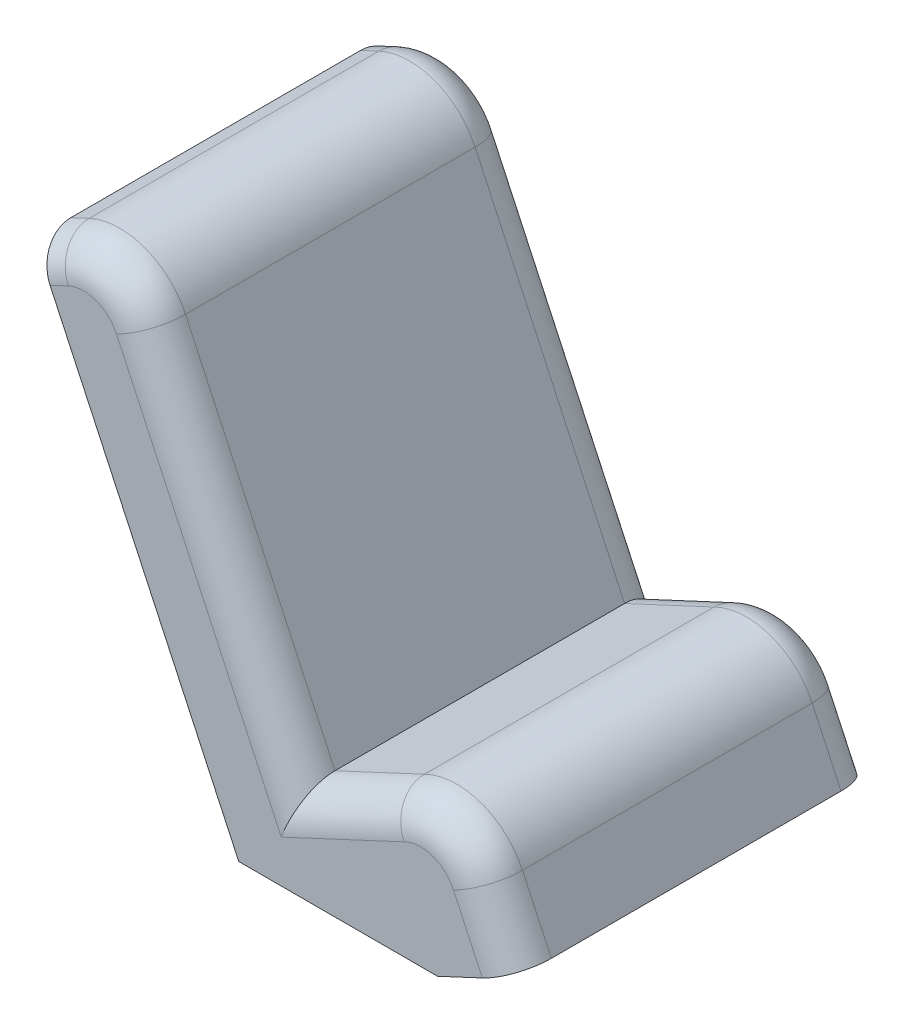
ISO-10303-21;
HEADER;
FILE_DESCRIPTION(('STEP AP214'),'2;1');
FILE_NAME('part.step','',(''),(''),'','','');
FILE_SCHEMA(('AUTOMOTIVE_DESIGN { 1 0 10303 214 1 1 1 1 }'));
ENDSEC;
DATA;
#1=APPLICATION_CONTEXT('core data for automotive mechanical design processes');
#2=APPLICATION_PROTOCOL_DEFINITION('international standard','automotive_design',2000,#1);
#3=PRODUCT_CONTEXT('',#1,'mechanical');
#4=PRODUCT('Part','Part','',(#3));
#5=PRODUCT_RELATED_PRODUCT_CATEGORY('part','',(#4));
#6=PRODUCT_DEFINITION_FORMATION('','',#4);
#7=PRODUCT_DEFINITION_CONTEXT('part definition',#1,'design');
#8=PRODUCT_DEFINITION('design','',#6,#7);
#9=PRODUCT_DEFINITION_SHAPE('','',#8);
#10=(LENGTH_UNIT() NAMED_UNIT(*) SI_UNIT(.MILLI.,.METRE.));
#11=(NAMED_UNIT(*) PLANE_ANGLE_UNIT() SI_UNIT($,.RADIAN.));
#12=(NAMED_UNIT(*) SI_UNIT($,.STERADIAN.) SOLID_ANGLE_UNIT());
#13=UNCERTAINTY_MEASURE_WITH_UNIT(LENGTH_MEASURE(1.E-05),#10,'distance_accuracy_value','');
#14=(GEOMETRIC_REPRESENTATION_CONTEXT(3) GLOBAL_UNCERTAINTY_ASSIGNED_CONTEXT((#13)) GLOBAL_UNIT_ASSIGNED_CONTEXT((#10,
#11,#12)) REPRESENTATION_CONTEXT('',''));
#15=CARTESIAN_POINT('',(0.,0.,0.));
#16=DIRECTION('',(0.,0.,1.));
#17=DIRECTION('',(1.,0.,0.));
#18=AXIS2_PLACEMENT_3D('',#15,#16,#17);
#19=CARTESIAN_POINT('',(-55.9569189786001,120.,50.));
#20=DIRECTION('',(0.422618261740701,-0.906307787036649,0.));
#21=DIRECTION('',(0.906307787036649,0.422618261740701,0.));
#22=AXIS2_PLACEMENT_3D('',#19,#20,#21);
#23=PLANE('',#22);
#24=DIRECTION('',(-0.906307787036649,-0.422618261740701,0.));
#25=VECTOR('',#24,1.);
#26=CARTESIAN_POINT('',(-55.9569189786001,120.,-40.));
#27=LINE('',#26,#25);
#28=CARTESIAN_POINT('',(-49.0830747193332,123.205326219061,-40.));
#29=VERTEX_POINT('',#28);
#30=CARTESIAN_POINT('',(-54.1443034045268,120.845236523481,-40.));
#31=VERTEX_POINT('',#30);
#32=EDGE_CURVE('E367',#29,#31,#27,.T.);
#33=ORIENTED_EDGE('',*,*,#32,.T.);
#34=DIRECTION('',(0.,0.,1.));
#35=VECTOR('',#34,1.);
#36=CARTESIAN_POINT('',(-54.1443034045268,120.845236523481,50.));
#37=LINE('',#36,#35);
#38=CARTESIAN_POINT('',(-54.1443034045268,120.845236523481,40.));
#39=VERTEX_POINT('',#38);
#40=EDGE_CURVE('E62',#31,#39,#37,.T.);
#41=ORIENTED_EDGE('',*,*,#40,.T.);
#42=DIRECTION('',(-0.906307787036649,-0.422618261740701,0.));
#43=VECTOR('',#42,1.);
#44=CARTESIAN_POINT('',(-49.0830747193332,123.205326219061,40.));
#45=LINE('',#44,#43);
#46=CARTESIAN_POINT('',(-49.0830747193332,123.205326219061,40.));
#47=VERTEX_POINT('',#46);
#48=EDGE_CURVE('E243',#39,#47,#45,.F.);
#49=ORIENTED_EDGE('',*,*,#48,.T.);
#50=DIRECTION('',(0.,0.,-1.));
#51=VECTOR('',#50,1.);
#52=CARTESIAN_POINT('',(-49.0830747193332,123.205326219061,50.));
#53=LINE('',#52,#51);
#54=EDGE_CURVE('E199',#47,#29,#53,.T.);
#55=ORIENTED_EDGE('',*,*,#54,.T.);
#56=EDGE_LOOP('',(#33,#41,#49,#55));
#57=FACE_BOUND('',#56,.T.);
#58=ADVANCED_FACE('F37',(#57),#23,.F.);
#59=CARTESIAN_POINT('',(-55.9569189786001,120.,50.));
#60=DIRECTION('',(0.906307787036649,0.422618261740701,0.));
#61=DIRECTION('',(-0.422618261740701,0.906307787036649,0.));
#62=AXIS2_PLACEMENT_3D('',#59,#60,#61);
#63=PLANE('',#62);
#64=CARTESIAN_POINT('',(-51.7307363611931,110.936922129634,-40.));
#65=DIRECTION('',(0.906307787036649,0.422618261740701,0.));
#66=DIRECTION('',(-0.422618261740701,0.906307787036649,0.));
#67=AXIS2_PLACEMENT_3D('',#64,#65,#66);
#68=CIRCLE('',#67,8.);
#69=CARTESIAN_POINT('',(-55.1116824551187,118.187384425927,-40.));
#70=VERTEX_POINT('',#69);
#71=CARTESIAN_POINT('',(-51.7307363611931,110.936922129634,-48.));
#72=VERTEX_POINT('',#71);
#73=EDGE_CURVE('E325',#70,#72,#68,.F.);
#74=ORIENTED_EDGE('',*,*,#73,.T.);
#75=DIRECTION('',(0.422618261740701,-0.906307787036649,0.));
#76=VECTOR('',#75,1.);
#77=CARTESIAN_POINT('',(-55.9569189786001,120.,-48.));
#78=LINE('',#77,#76);
#79=CARTESIAN_POINT('',(0.,0.,-48.));
#80=VERTEX_POINT('',#79);
#81=EDGE_CURVE('E327',#72,#80,#78,.T.);
#82=ORIENTED_EDGE('',*,*,#81,.T.);
#83=DIRECTION('',(0.,0.,-1.));
#84=VECTOR('',#83,1.);
#85=CARTESIAN_POINT('',(0.,0.,50.));
#86=LINE('',#85,#84);
#87=CARTESIAN_POINT('',(0.,0.,48.));
#88=VERTEX_POINT('',#87);
#89=EDGE_CURVE('E192',#88,#80,#86,.T.);
#90=ORIENTED_EDGE('',*,*,#89,.F.);
#91=DIRECTION('',(-0.422618261740701,0.906307787036649,0.));
#92=VECTOR('',#91,1.);
#93=CARTESIAN_POINT('',(-51.7307363611931,110.936922129633,48.));
#94=LINE('',#93,#92);
#95=CARTESIAN_POINT('',(-51.7307363611931,110.936922129634,48.));
#96=VERTEX_POINT('',#95);
#97=EDGE_CURVE('E318',#88,#96,#94,.T.);
#98=ORIENTED_EDGE('',*,*,#97,.T.);
#99=CARTESIAN_POINT('',(-51.7307363611931,110.936922129634,40.));
#100=DIRECTION('',(0.906307787036649,0.422618261740701,0.));
#101=DIRECTION('',(-0.422618261740701,0.906307787036649,0.));
#102=AXIS2_PLACEMENT_3D('',#99,#100,#101);
#103=CIRCLE('',#102,8.);
#104=CARTESIAN_POINT('',(-55.1116824551187,118.187384425927,40.));
#105=VERTEX_POINT('',#104);
#106=EDGE_CURVE('E320',#96,#105,#103,.F.);
#107=ORIENTED_EDGE('',*,*,#106,.T.);
#108=DIRECTION('',(0.,0.,-1.));
#109=VECTOR('',#108,1.);
#110=CARTESIAN_POINT('',(-55.1116824551187,118.187384425927,50.));
#111=LINE('',#110,#109);
#112=EDGE_CURVE('E323',#105,#70,#111,.T.);
#113=ORIENTED_EDGE('',*,*,#112,.T.);
#114=EDGE_LOOP('',(#74,#82,#90,#98,#107,#113));
#115=FACE_BOUND('',#114,.T.);
#116=ADVANCED_FACE('F438',(#115),#63,.F.);
#117=CARTESIAN_POINT('',(0.,0.,50.));
#118=DIRECTION('',(0.,1.,0.));
#119=DIRECTION('',(0.,0.,1.));
#120=AXIS2_PLACEMENT_3D('',#117,#118,#119);
#121=PLANE('',#120);
#122=CARTESIAN_POINT('',(30.,0.,0.));
#123=DIRECTION('',(0.,1.,0.));
#124=DIRECTION('',(0.,0.,1.));
#125=AXIS2_PLACEMENT_3D('',#122,#123,#124);
#126=CIRCLE('',#125,7.5);
#127=CARTESIAN_POINT('',(30.,0.,7.5));
#128=VERTEX_POINT('',#127);
#129=EDGE_CURVE('E223',#128,#128,#126,.F.);
#130=ORIENTED_EDGE('',*,*,#129,.F.);
#131=EDGE_LOOP('',(#130));
#132=FACE_BOUND('',#131,.T.);
#133=ORIENTED_EDGE('',*,*,#89,.T.);
#134=DIRECTION('',(-0.740965645273291,0.,0.671542934237816));
#135=VECTOR('',#134,1.);
#136=CARTESIAN_POINT('',(-30.7220321216671,0.,-20.1563830545432));
#137=LINE('',#136,#135);
#138=CARTESIAN_POINT('',(2.20675583792499,0.,-50.));
#139=VERTEX_POINT('',#138);
#140=EDGE_CURVE('E332',#80,#139,#137,.F.);
#141=ORIENTED_EDGE('',*,*,#140,.T.);
#142=DIRECTION('',(1.,0.,0.));
#143=VECTOR('',#142,1.);
#144=CARTESIAN_POINT('',(0.,0.,-50.));
#145=LINE('',#144,#143);
#146=CARTESIAN_POINT('',(57.1,0.,-50.));
#147=VERTEX_POINT('',#146);
#148=EDGE_CURVE('E188',#139,#147,#145,.T.);
#149=ORIENTED_EDGE('',*,*,#148,.T.);
#150=DIRECTION('',(0.,0.,-1.));
#151=VECTOR('',#150,1.);
#152=CARTESIAN_POINT('',(57.1,0.,50.));
#153=LINE('',#152,#151);
#154=CARTESIAN_POINT('',(57.1,0.,50.));
#155=VERTEX_POINT('',#154);
#156=EDGE_CURVE('E184',#155,#147,#153,.T.);
#157=ORIENTED_EDGE('',*,*,#156,.F.);
#158=DIRECTION('',(1.,0.,0.));
#159=VECTOR('',#158,1.);
#160=CARTESIAN_POINT('',(0.,0.,50.));
#161=LINE('',#160,#159);
#162=CARTESIAN_POINT('',(2.20675583792499,0.,50.));
#163=VERTEX_POINT('',#162);
#164=EDGE_CURVE('E171',#163,#155,#161,.T.);
#165=ORIENTED_EDGE('',*,*,#164,.F.);
#166=DIRECTION('',(-0.740965645273291,0.,-0.671542934237816));
#167=VECTOR('',#166,1.);
#168=CARTESIAN_POINT('',(-24.0910683230393,0.,26.1660771807977));
#169=LINE('',#168,#167);
#170=EDGE_CURVE('E330',#163,#88,#169,.T.);
#171=ORIENTED_EDGE('',*,*,#170,.T.);
#172=EDGE_LOOP('',(#133,#141,#149,#157,#165,#171));
#173=FACE_BOUND('',#172,.T.);
#174=ADVANCED_FACE('F186',(#132,#173),#121,.F.);
#175=CARTESIAN_POINT('',(57.1,0.,50.));
#176=DIRECTION('',(-0.422618261740701,0.906307787036649,0.));
#177=DIRECTION('',(-0.906307787036649,-0.422618261740701,0.));
#178=AXIS2_PLACEMENT_3D('',#175,#176,#177);
#179=PLANE('',#178);
#180=DIRECTION('',(0.906307787036649,0.422618261740701,0.));
#181=VECTOR('',#180,1.);
#182=CARTESIAN_POINT('',(57.1,0.,-50.));
#183=LINE('',#182,#181);
#184=CARTESIAN_POINT('',(69.481991334729,5.77381738259299,-50.));
#185=VERTEX_POINT('',#184);
#186=EDGE_CURVE('E181',#147,#185,#183,.T.);
#187=ORIENTED_EDGE('',*,*,#186,.T.);
#188=CARTESIAN_POINT('',(69.481991334729,5.77381738259299,-40.));
#189=DIRECTION('',(-0.422618261740701,0.906307787036649,0.));
#190=DIRECTION('',(-0.906307787036649,-0.422618261740701,0.));
#191=AXIS2_PLACEMENT_3D('',#188,#189,#190);
#192=CIRCLE('',#191,10.);
#193=CARTESIAN_POINT('',(78.5450692050955,10.,-40.));
#194=VERTEX_POINT('',#193);
#195=EDGE_CURVE('E381',#185,#194,#192,.F.);
#196=ORIENTED_EDGE('',*,*,#195,.T.);
#197=DIRECTION('',(0.,0.,-1.));
#198=VECTOR('',#197,1.);
#199=CARTESIAN_POINT('',(78.5450692050955,10.,50.));
#200=LINE('',#199,#198);
#201=CARTESIAN_POINT('',(78.5450692050955,10.,40.));
#202=VERTEX_POINT('',#201);
#203=EDGE_CURVE('E193',#202,#194,#200,.T.);
#204=ORIENTED_EDGE('',*,*,#203,.F.);
#205=CARTESIAN_POINT('',(69.481991334729,5.77381738259297,40.));
#206=DIRECTION('',(-0.422618261740701,0.906307787036649,0.));
#207=DIRECTION('',(-0.906307787036649,-0.422618261740701,0.));
#208=AXIS2_PLACEMENT_3D('',#205,#206,#207);
#209=CIRCLE('',#208,10.);
#210=CARTESIAN_POINT('',(69.481991334729,5.77381738259299,50.));
#211=VERTEX_POINT('',#210);
#212=EDGE_CURVE('E198',#202,#211,#209,.F.);
#213=ORIENTED_EDGE('',*,*,#212,.T.);
#214=DIRECTION('',(0.906307787036649,0.422618261740701,0.));
#215=VECTOR('',#214,1.);
#216=CARTESIAN_POINT('',(57.1,0.,50.));
#217=LINE('',#216,#215);
#218=EDGE_CURVE('E176',#155,#211,#217,.T.);
#219=ORIENTED_EDGE('',*,*,#218,.F.);
#220=ORIENTED_EDGE('',*,*,#156,.T.);
#221=EDGE_LOOP('',(#187,#196,#204,#213,#219,#220));
#222=FACE_BOUND('',#221,.T.);
#223=ADVANCED_FACE('F195',(#222),#179,.F.);
#224=CARTESIAN_POINT('',(78.5450692050955,10.,50.));
#225=DIRECTION('',(-0.906307787036649,-0.422618261740702,0.));
#226=DIRECTION('',(0.422618261740702,-0.906307787036649,0.));
#227=AXIS2_PLACEMENT_3D('',#224,#225,#226);
#228=PLANE('',#227);
#229=ORIENTED_EDGE('',*,*,#203,.T.);
#230=DIRECTION('',(-0.422618261740702,0.906307787036649,0.));
#231=VECTOR('',#230,1.);
#232=CARTESIAN_POINT('',(78.5450692050955,10.,-40.));
#233=LINE('',#232,#231);
#234=CARTESIAN_POINT('',(70.5740684534012,27.0938662753953,-40.));
#235=VERTEX_POINT('',#234);
#236=EDGE_CURVE('E251',#194,#235,#233,.T.);
#237=ORIENTED_EDGE('',*,*,#236,.T.);
#238=DIRECTION('',(0.,0.,-1.));
#239=VECTOR('',#238,1.);
#240=CARTESIAN_POINT('',(70.5740684534012,27.0938662753953,50.));
#241=LINE('',#240,#239);
#242=CARTESIAN_POINT('',(70.5740684534012,27.0938662753953,40.));
#243=VERTEX_POINT('',#242);
#244=EDGE_CURVE('E217',#243,#235,#241,.T.);
#245=ORIENTED_EDGE('',*,*,#244,.F.);
#246=DIRECTION('',(-0.422618261740702,0.906307787036649,0.));
#247=VECTOR('',#246,1.);
#248=CARTESIAN_POINT('',(78.5450692050955,9.99999999999999,40.));
#249=LINE('',#248,#247);
#250=EDGE_CURVE('E238',#243,#202,#249,.F.);
#251=ORIENTED_EDGE('',*,*,#250,.T.);
#252=EDGE_LOOP('',(#229,#237,#245,#251));
#253=FACE_BOUND('',#252,.T.);
#254=ADVANCED_FACE('F371',(#253),#228,.F.);
#255=CARTESIAN_POINT('',(52.4479127126682,18.6415010405812,50.));
#256=DIRECTION('',(0.,0.,-1.));
#257=DIRECTION('',(-1.,0.,0.));
#258=AXIS2_PLACEMENT_3D('',#255,#256,#257);
#259=CYLINDRICAL_SURFACE('',#258,20.);
#260=ORIENTED_EDGE('',*,*,#244,.T.);
#261=CARTESIAN_POINT('',(52.4479127126682,18.6415010405812,-40.));
#262=DIRECTION('',(0.,0.,1.));
#263=DIRECTION('',(1.,0.,0.));
#264=AXIS2_PLACEMENT_3D('',#261,#262,#263);
#265=CIRCLE('',#264,20.);
#266=CARTESIAN_POINT('',(43.49,36.5232179556937,-40.));
#267=VERTEX_POINT('',#266);
#268=EDGE_CURVE('E362',#235,#267,#265,.T.);
#269=ORIENTED_EDGE('',*,*,#268,.T.);
#270=DIRECTION('',(0.,0.,-1.));
#271=VECTOR('',#270,1.);
#272=CARTESIAN_POINT('',(43.49,36.5232179556937,50.));
#273=LINE('',#272,#271);
#274=CARTESIAN_POINT('',(43.49,36.5232179556937,40.));
#275=VERTEX_POINT('',#274);
#276=EDGE_CURVE('E214',#275,#267,#273,.T.);
#277=ORIENTED_EDGE('',*,*,#276,.F.);
#278=CARTESIAN_POINT('',(52.4479127126682,18.6415010405812,40.));
#279=DIRECTION('',(0.,0.,1.));
#280=DIRECTION('',(1.,0.,0.));
#281=AXIS2_PLACEMENT_3D('',#278,#279,#280);
#282=CIRCLE('',#281,20.);
#283=EDGE_CURVE('E245',#275,#243,#282,.F.);
#284=ORIENTED_EDGE('',*,*,#283,.T.);
#285=EDGE_LOOP('',(#260,#269,#277,#284));
#286=FACE_BOUND('',#285,.T.);
#287=ADVANCED_FACE('F375',(#286),#259,.T.);
#288=CARTESIAN_POINT('',(43.49,36.5232179556937,50.));
#289=DIRECTION('',(0.4226182617407,-0.906307787036649,0.));
#290=DIRECTION('',(0.90630778703665,0.4226182617407,0.));
#291=AXIS2_PLACEMENT_3D('',#288,#289,#290);
#292=PLANE('',#291);
#293=ORIENTED_EDGE('',*,*,#276,.T.);
#294=DIRECTION('',(-0.90630778703665,-0.4226182617407,0.));
#295=VECTOR('',#294,1.);
#296=CARTESIAN_POINT('',(43.49,36.5232179556937,-40.));
#297=LINE('',#296,#295);
#298=CARTESIAN_POINT('',(18.778379347475,25.,-40.));
#299=VERTEX_POINT('',#298);
#300=EDGE_CURVE('E366',#267,#299,#297,.T.);
#301=ORIENTED_EDGE('',*,*,#300,.T.);
#302=DIRECTION('',(0.,0.,-1.));
#303=VECTOR('',#302,1.);
#304=CARTESIAN_POINT('',(18.778379347475,25.,50.));
#305=LINE('',#304,#303);
#306=CARTESIAN_POINT('',(18.778379347475,25.,40.));
#307=VERTEX_POINT('',#306);
#308=EDGE_CURVE('E211',#307,#299,#305,.T.);
#309=ORIENTED_EDGE('',*,*,#308,.F.);
#310=DIRECTION('',(-0.90630778703665,-0.4226182617407,0.));
#311=VECTOR('',#310,1.);
#312=CARTESIAN_POINT('',(43.49,36.5232179556937,40.));
#313=LINE('',#312,#311);
#314=EDGE_CURVE('E247',#307,#275,#313,.F.);
#315=ORIENTED_EDGE('',*,*,#314,.T.);
#316=EDGE_LOOP('',(#293,#301,#309,#315));
#317=FACE_BOUND('',#316,.T.);
#318=ADVANCED_FACE('F423',(#317),#292,.F.);
#319=CARTESIAN_POINT('',(18.778379347475,25.,50.));
#320=DIRECTION('',(-0.906307787036649,-0.422618261740701,0.));
#321=DIRECTION('',(0.422618261740701,-0.906307787036649,0.));
#322=AXIS2_PLACEMENT_3D('',#319,#320,#321);
#323=PLANE('',#322);
#324=ORIENTED_EDGE('',*,*,#308,.T.);
#325=DIRECTION('',(-0.422618261740701,0.906307787036649,0.));
#326=VECTOR('',#325,1.);
#327=CARTESIAN_POINT('',(18.778379347475,25.,-40.));
#328=LINE('',#327,#326);
#329=CARTESIAN_POINT('',(-22.504553743786,113.531535713142,-40.));
#330=VERTEX_POINT('',#329);
#331=EDGE_CURVE('E382',#299,#330,#328,.T.);
#332=ORIENTED_EDGE('',*,*,#331,.T.);
#333=DIRECTION('',(0.,0.,-1.));
#334=VECTOR('',#333,1.);
#335=CARTESIAN_POINT('',(-22.504553743786,113.531535713142,50.));
#336=LINE('',#335,#334);
#337=CARTESIAN_POINT('',(-22.504553743786,113.531535713142,40.));
#338=VERTEX_POINT('',#337);
#339=EDGE_CURVE('E202',#338,#330,#336,.T.);
#340=ORIENTED_EDGE('',*,*,#339,.F.);
#341=DIRECTION('',(-0.422618261740701,0.906307787036649,0.));
#342=VECTOR('',#341,1.);
#343=CARTESIAN_POINT('',(18.778379347475,25.,40.));
#344=LINE('',#343,#342);
#345=EDGE_CURVE('E241',#338,#307,#344,.F.);
#346=ORIENTED_EDGE('',*,*,#345,.T.);
#347=EDGE_LOOP('',(#324,#332,#340,#346));
#348=FACE_BOUND('',#347,.T.);
#349=ADVANCED_FACE('F427',(#348),#323,.F.);
#350=CARTESIAN_POINT('',(-40.6307094845191,105.079170478328,50.));
#351=DIRECTION('',(0.,0.,-1.));
#352=DIRECTION('',(-1.,0.,0.));
#353=AXIS2_PLACEMENT_3D('',#350,#351,#352);
#354=CYLINDRICAL_SURFACE('',#353,20.);
#355=ORIENTED_EDGE('',*,*,#339,.T.);
#356=CARTESIAN_POINT('',(-40.6307094845191,105.079170478328,-40.));
#357=DIRECTION('',(0.,0.,1.));
#358=DIRECTION('',(1.,0.,0.));
#359=AXIS2_PLACEMENT_3D('',#356,#357,#358);
#360=CIRCLE('',#359,20.);
#361=EDGE_CURVE('E321',#330,#29,#360,.T.);
#362=ORIENTED_EDGE('',*,*,#361,.T.);
#363=ORIENTED_EDGE('',*,*,#54,.F.);
#364=CARTESIAN_POINT('',(-40.6307094845191,105.079170478328,40.));
#365=DIRECTION('',(0.,0.,1.));
#366=DIRECTION('',(1.,0.,0.));
#367=AXIS2_PLACEMENT_3D('',#364,#365,#366);
#368=CIRCLE('',#367,20.);
#369=EDGE_CURVE('E249',#47,#338,#368,.F.);
#370=ORIENTED_EDGE('',*,*,#369,.T.);
#371=EDGE_LOOP('',(#355,#362,#363,#370));
#372=FACE_BOUND('',#371,.T.);
#373=ADVANCED_FACE('F393',(#372),#354,.T.);
#374=CARTESIAN_POINT('',(-40.6307094845191,105.079170478328,50.));
#375=DIRECTION('',(0.,0.,1.));
#376=DIRECTION('',(1.,0.,0.));
#377=AXIS2_PLACEMENT_3D('',#374,#375,#376);
#378=PLANE('',#377);
#379=DIRECTION('',(-0.906307787036649,-0.422618261740701,0.));
#380=VECTOR('',#379,1.);
#381=CARTESIAN_POINT('',(-51.7307363611931,110.936922129634,50.));
#382=LINE('',#381,#380);
#383=CARTESIAN_POINT('',(-44.8568921019262,114.142248348694,50.));
#384=VERTEX_POINT('',#383);
#385=CARTESIAN_POINT('',(-49.9181207871198,111.782158653115,50.));
#386=VERTEX_POINT('',#385);
#387=EDGE_CURVE('E228',#384,#386,#382,.T.);
#388=ORIENTED_EDGE('',*,*,#387,.T.);
#389=DIRECTION('',(0.422618261740701,-0.906307787036649,0.));
#390=VECTOR('',#389,1.);
#391=CARTESIAN_POINT('',(1.8126155740733,0.845236523481404,50.));
#392=LINE('',#391,#390);
#393=EDGE_CURVE('E11',#386,#163,#392,.T.);
#394=ORIENTED_EDGE('',*,*,#393,.T.);
#395=ORIENTED_EDGE('',*,*,#164,.T.);
#396=ORIENTED_EDGE('',*,*,#218,.T.);
#397=DIRECTION('',(-0.422618261740702,0.906307787036649,0.));
#398=VECTOR('',#397,1.);
#399=CARTESIAN_POINT('',(61.5109905830347,22.8676836579882,50.));
#400=LINE('',#399,#398);
#401=CARTESIAN_POINT('',(61.5109905830347,22.8676836579882,50.));
#402=VERTEX_POINT('',#401);
#403=EDGE_CURVE('E236',#211,#402,#400,.T.);
#404=ORIENTED_EDGE('',*,*,#403,.T.);
#405=CARTESIAN_POINT('',(52.4479127126682,18.6415010405812,50.));
#406=DIRECTION('',(0.,0.,1.));
#407=DIRECTION('',(1.,0.,0.));
#408=AXIS2_PLACEMENT_3D('',#405,#406,#407);
#409=CIRCLE('',#408,10.);
#410=CARTESIAN_POINT('',(47.8652653123671,27.5296584876854,50.));
#411=VERTEX_POINT('',#410);
#412=EDGE_CURVE('E234',#402,#411,#409,.T.);
#413=ORIENTED_EDGE('',*,*,#412,.T.);
#414=DIRECTION('',(-0.90630778703665,-0.4226182617407,0.));
#415=VECTOR('',#414,1.);
#416=CARTESIAN_POINT('',(23.004561964882,15.9369221296335,50.));
#417=LINE('',#416,#415);
#418=CARTESIAN_POINT('',(13.9414840945155,11.7107395122265,50.));
#419=VERTEX_POINT('',#418);
#420=EDGE_CURVE('E232',#411,#419,#417,.T.);
#421=ORIENTED_EDGE('',*,*,#420,.T.);
#422=DIRECTION('',(-0.422618261740701,0.906307787036649,0.));
#423=VECTOR('',#422,1.);
#424=CARTESIAN_POINT('',(-31.5676316141525,109.305353095735,50.));
#425=LINE('',#424,#423);
#426=CARTESIAN_POINT('',(-31.5676316141525,109.305353095735,50.));
#427=VERTEX_POINT('',#426);
#428=EDGE_CURVE('E230',#419,#427,#425,.T.);
#429=ORIENTED_EDGE('',*,*,#428,.T.);
#430=CARTESIAN_POINT('',(-40.6307094845191,105.079170478328,50.));
#431=DIRECTION('',(0.,0.,1.));
#432=DIRECTION('',(1.,0.,0.));
#433=AXIS2_PLACEMENT_3D('',#430,#431,#432);
#434=CIRCLE('',#433,10.);
#435=EDGE_CURVE('E226',#427,#384,#434,.T.);
#436=ORIENTED_EDGE('',*,*,#435,.T.);
#437=EDGE_LOOP('',(#388,#394,#395,#396,#404,#413,#421,#429,#436));
#438=FACE_BOUND('',#437,.T.);
#439=ADVANCED_FACE('F173',(#438),#378,.T.);
#440=CARTESIAN_POINT('',(-40.6307094845191,105.079170478328,-50.));
#441=DIRECTION('',(0.,0.,1.));
#442=DIRECTION('',(1.,0.,0.));
#443=AXIS2_PLACEMENT_3D('',#440,#441,#442);
#444=PLANE('',#443);
#445=ORIENTED_EDGE('',*,*,#148,.F.);
#446=DIRECTION('',(-0.422618261740701,0.906307787036649,0.));
#447=VECTOR('',#446,1.);
#448=CARTESIAN_POINT('',(-45.6919381697128,102.719080782748,-50.));
#449=LINE('',#448,#447);
#450=CARTESIAN_POINT('',(-49.9181207871198,111.782158653115,-50.));
#451=VERTEX_POINT('',#450);
#452=EDGE_CURVE('E334',#139,#451,#449,.T.);
#453=ORIENTED_EDGE('',*,*,#452,.T.);
#454=DIRECTION('',(-0.906307787036649,-0.422618261740701,0.));
#455=VECTOR('',#454,1.);
#456=CARTESIAN_POINT('',(-44.8568921019261,114.142248348695,-50.));
#457=LINE('',#456,#455);
#458=CARTESIAN_POINT('',(-44.8568921019262,114.142248348694,-50.));
#459=VERTEX_POINT('',#458);
#460=EDGE_CURVE('E408',#451,#459,#457,.F.);
#461=ORIENTED_EDGE('',*,*,#460,.T.);
#462=CARTESIAN_POINT('',(-40.6307094845191,105.079170478328,-50.));
#463=DIRECTION('',(0.,0.,1.));
#464=DIRECTION('',(1.,0.,0.));
#465=AXIS2_PLACEMENT_3D('',#462,#463,#464);
#466=CIRCLE('',#465,10.);
#467=CARTESIAN_POINT('',(-31.5676316141525,109.305353095735,-50.));
#468=VERTEX_POINT('',#467);
#469=EDGE_CURVE('E373',#459,#468,#466,.F.);
#470=ORIENTED_EDGE('',*,*,#469,.T.);
#471=DIRECTION('',(-0.422618261740701,0.906307787036649,0.));
#472=VECTOR('',#471,1.);
#473=CARTESIAN_POINT('',(-31.5676316141526,109.305353095735,-50.));
#474=LINE('',#473,#472);
#475=CARTESIAN_POINT('',(13.9414840945155,11.7107395122265,-50.));
#476=VERTEX_POINT('',#475);
#477=EDGE_CURVE('E410',#468,#476,#474,.F.);
#478=ORIENTED_EDGE('',*,*,#477,.T.);
#479=DIRECTION('',(-0.90630778703665,-0.4226182617407,0.));
#480=VECTOR('',#479,1.);
#481=CARTESIAN_POINT('',(4.87840622414897,7.48455689481947,-50.));
#482=LINE('',#481,#480);
#483=CARTESIAN_POINT('',(47.8652653123672,27.5296584876855,-50.));
#484=VERTEX_POINT('',#483);
#485=EDGE_CURVE('E415',#476,#484,#482,.F.);
#486=ORIENTED_EDGE('',*,*,#485,.T.);
#487=CARTESIAN_POINT('',(52.4479127126682,18.6415010405812,-50.));
#488=DIRECTION('',(0.,0.,1.));
#489=DIRECTION('',(1.,0.,0.));
#490=AXIS2_PLACEMENT_3D('',#487,#488,#489);
#491=CIRCLE('',#490,10.);
#492=CARTESIAN_POINT('',(61.5109905830347,22.8676836579882,-50.));
#493=VERTEX_POINT('',#492);
#494=EDGE_CURVE('E385',#484,#493,#491,.F.);
#495=ORIENTED_EDGE('',*,*,#494,.T.);
#496=DIRECTION('',(-0.422618261740702,0.906307787036649,0.));
#497=VECTOR('',#496,1.);
#498=CARTESIAN_POINT('',(11.7790238474934,129.518230492907,-50.));
#499=LINE('',#498,#497);
#500=EDGE_CURVE('E360',#493,#185,#499,.F.);
#501=ORIENTED_EDGE('',*,*,#500,.T.);
#502=ORIENTED_EDGE('',*,*,#186,.F.);
#503=EDGE_LOOP('',(#445,#453,#461,#470,#478,#486,#495,#501,#502));
#504=FACE_BOUND('',#503,.T.);
#505=ADVANCED_FACE('F416',(#504),#444,.F.);
#506=CARTESIAN_POINT('',(30.,-10.,0.));
#507=DIRECTION('',(0.,1.,0.));
#508=DIRECTION('',(0.,0.,1.));
#509=AXIS2_PLACEMENT_3D('',#506,#507,#508);
#510=CYLINDRICAL_SURFACE('',#509,7.5);
#511=CARTESIAN_POINT('',(30.,-10.,0.));
#512=DIRECTION('',(0.,-1.,0.));
#513=DIRECTION('',(0.,0.,-1.));
#514=AXIS2_PLACEMENT_3D('',#511,#512,#513);
#515=CIRCLE('',#514,7.5);
#516=CARTESIAN_POINT('',(30.,-10.,-7.5));
#517=VERTEX_POINT('',#516);
#518=EDGE_CURVE('E207',#517,#517,#515,.T.);
#519=ORIENTED_EDGE('',*,*,#518,.F.);
#520=EDGE_LOOP('',(#519));
#521=FACE_BOUND('',#520,.T.);
#522=ORIENTED_EDGE('',*,*,#129,.T.);
#523=EDGE_LOOP('',(#522));
#524=FACE_BOUND('',#523,.T.);
#525=ADVANCED_FACE('F607',(#521,#524),#510,.T.);
#526=CARTESIAN_POINT('',(30.,-10.,0.));
#527=DIRECTION('',(0.,-1.,0.));
#528=DIRECTION('',(0.,0.,-1.));
#529=AXIS2_PLACEMENT_3D('',#526,#527,#528);
#530=PLANE('',#529);
#531=ORIENTED_EDGE('',*,*,#518,.T.);
#532=EDGE_LOOP('',(#531));
#533=FACE_BOUND('',#532,.T.);
#534=ADVANCED_FACE('F286',(#533),#530,.T.);
#535=CARTESIAN_POINT('',(-44.8568921019261,114.142248348695,40.));
#536=DIRECTION('',(0.906307787036649,0.422618261740701,0.));
#537=DIRECTION('',(-0.422618261740701,0.906307787036649,0.));
#538=AXIS2_PLACEMENT_3D('',#535,#536,#537);
#539=CYLINDRICAL_SURFACE('',#538,10.);
#540=ORIENTED_EDGE('',*,*,#48,.F.);
#541=CARTESIAN_POINT('',(-49.9181207871198,111.782158653115,40.));
#542=DIRECTION('',(0.906307787036648,0.422618261740703,0.));
#543=DIRECTION('',(-0.422618261740703,0.906307787036648,0.));
#544=AXIS2_PLACEMENT_3D('',#541,#542,#543);
#545=CIRCLE('',#544,10.);
#546=EDGE_CURVE('E47',#39,#386,#545,.T.);
#547=ORIENTED_EDGE('',*,*,#546,.T.);
#548=ORIENTED_EDGE('',*,*,#387,.F.);
#549=CARTESIAN_POINT('',(-44.8568921019262,114.142248348694,40.));
#550=DIRECTION('',(0.906307787036649,0.422618261740701,0.));
#551=DIRECTION('',(-0.422618261740701,0.906307787036649,0.));
#552=AXIS2_PLACEMENT_3D('',#549,#550,#551);
#553=CIRCLE('',#552,10.);
#554=EDGE_CURVE('E663',#47,#384,#553,.T.);
#555=ORIENTED_EDGE('',*,*,#554,.F.);
#556=EDGE_LOOP('',(#540,#547,#548,#555));
#557=FACE_BOUND('',#556,.T.);
#558=ADVANCED_FACE('F282',(#557),#539,.T.);
#559=CARTESIAN_POINT('',(-40.6307094845191,105.079170478328,40.));
#560=DIRECTION('',(0.,0.,1.));
#561=DIRECTION('',(1.,0.,0.));
#562=AXIS2_PLACEMENT_3D('',#559,#560,#561);
#563=DEGENERATE_TOROIDAL_SURFACE('',#562,10.,10.,.T.);
#564=ORIENTED_EDGE('',*,*,#554,.T.);
#565=ORIENTED_EDGE('',*,*,#435,.F.);
#566=CARTESIAN_POINT('',(-31.5676316141525,109.305353095735,40.));
#567=DIRECTION('',(0.422618261740694,-0.906307787036653,0.));
#568=DIRECTION('',(0.906307787036653,0.422618261740694,0.));
#569=AXIS2_PLACEMENT_3D('',#566,#567,#568);
#570=CIRCLE('',#569,10.);
#571=EDGE_CURVE('E665',#338,#427,#570,.T.);
#572=ORIENTED_EDGE('',*,*,#571,.F.);
#573=ORIENTED_EDGE('',*,*,#369,.F.);
#574=EDGE_LOOP('',(#564,#565,#572,#573));
#575=FACE_BOUND('',#574,.T.);
#576=ADVANCED_FACE('F278',(#575),#563,.T.);
#577=CARTESIAN_POINT('',(-31.5676316141526,109.305353095735,40.));
#578=DIRECTION('',(0.422618261740701,-0.906307787036649,0.));
#579=DIRECTION('',(0.906307787036649,0.422618261740701,0.));
#580=AXIS2_PLACEMENT_3D('',#577,#578,#579);
#581=CYLINDRICAL_SURFACE('',#580,10.);
#582=ORIENTED_EDGE('',*,*,#571,.T.);
#583=ORIENTED_EDGE('',*,*,#428,.F.);
#584=CARTESIAN_POINT('',(13.9414840945155,11.7107395122265,40.));
#585=DIRECTION('',(0.939692620785909,-0.342020143325667,0.));
#586=DIRECTION('',(-0.342020143325667,-0.939692620785909,0.));
#587=AXIS2_PLACEMENT_3D('',#584,#585,#586);
#588=ELLIPSE('',#587,14.1421356237309,10.);
#589=EDGE_CURVE('E264',#307,#419,#588,.T.);
#590=ORIENTED_EDGE('',*,*,#589,.F.);
#591=ORIENTED_EDGE('',*,*,#345,.F.);
#592=EDGE_LOOP('',(#582,#583,#590,#591));
#593=FACE_BOUND('',#592,.T.);
#594=ADVANCED_FACE('F275',(#593),#581,.T.);
#595=CARTESIAN_POINT('',(4.87840622414897,7.48455689481947,40.));
#596=DIRECTION('',(0.90630778703665,0.4226182617407,0.));
#597=DIRECTION('',(-0.4226182617407,0.90630778703665,0.));
#598=AXIS2_PLACEMENT_3D('',#595,#596,#597);
#599=CYLINDRICAL_SURFACE('',#598,10.);
#600=ORIENTED_EDGE('',*,*,#589,.T.);
#601=ORIENTED_EDGE('',*,*,#420,.F.);
#602=CARTESIAN_POINT('',(43.49,36.5232179556937,40.));
#603=CARTESIAN_POINT('',(43.4899871215679,36.5232453302412,40.2812295039492));
#604=CARTESIAN_POINT('',(43.4951641503938,36.5125375098578,40.5624546489469));
#605=CARTESIAN_POINT('',(43.5158049756471,36.4698491902479,41.1228928855631));
#606=CARTESIAN_POINT('',(43.5312682783646,36.4378697119964,41.4021060730993));
#607=CARTESIAN_POINT('',(43.5723743960121,36.3528651688435,41.956352635193));
#608=CARTESIAN_POINT('',(43.5980101606097,36.2998546801251,42.2313887679945));
#609=CARTESIAN_POINT('',(43.6592786644745,36.1731759342206,42.7755222709453));
#610=CARTESIAN_POINT('',(43.6949112822605,36.0995079280635,43.0446197132184));
#611=CARTESIAN_POINT('',(43.7759461579209,35.9319983029917,43.5750925504011));
#612=CARTESIAN_POINT('',(43.8213530144484,35.8381471882044,43.8364642443865));
#613=CARTESIAN_POINT('',(43.921611360086,35.6309613688761,44.3495000923967));
#614=CARTESIAN_POINT('',(43.9764630491035,35.5176262519405,44.6011640408112));
#615=CARTESIAN_POINT('',(44.095214682875,35.2723136373322,45.0929299681476));
#616=CARTESIAN_POINT('',(44.1591124468544,35.1403406327905,45.3330347150535));
#617=CARTESIAN_POINT('',(44.2955217123914,34.8586757873786,45.8000395193192));
#618=CARTESIAN_POINT('',(44.3680331657882,34.7089840455774,46.026939650498));
#619=CARTESIAN_POINT('',(44.5211659528222,34.392951895929,46.4659232803187));
#620=CARTESIAN_POINT('',(44.6017872428106,34.2266115776881,46.6780068586959));
#621=CARTESIAN_POINT('',(44.7705801818153,33.8784705290847,47.0858520054607));
#622=CARTESIAN_POINT('',(44.8587518320526,33.696669796222,47.2816135712087));
#623=CARTESIAN_POINT('',(45.0420637901316,33.3188449401421,47.6554858265513));
#624=CARTESIAN_POINT('',(45.137206388278,33.1228161424948,47.8335906693962));
#625=CARTESIAN_POINT('',(45.333772215973,32.7179941660196,48.1708070788402));
#626=CARTESIAN_POINT('',(45.4351953300009,32.50920122197,48.3299189946283));
#627=CARTESIAN_POINT('',(45.6436579941977,32.0802632331269,48.6280767738497));
#628=CARTESIAN_POINT('',(45.7506995602443,31.8601141142791,48.7671153670162));
#629=CARTESIAN_POINT('',(45.9696203252005,31.4101141730732,49.0240671113721));
#630=CARTESIAN_POINT('',(46.0814994364154,31.1802635265854,49.1419806453157));
#631=CARTESIAN_POINT('',(46.3092474413572,30.7126542062131,49.3557767714031));
#632=CARTESIAN_POINT('',(46.425113624638,30.4749009082236,49.4516740030178));
#633=CARTESIAN_POINT('',(46.6600626774803,29.9931272272216,49.6208302284468));
#634=CARTESIAN_POINT('',(46.7791445843617,29.7491087208564,49.6940959174529));
#635=CARTESIAN_POINT('',(47.0504359162495,29.1936191452132,49.8332514663889));
#636=CARTESIAN_POINT('',(47.2033509255957,28.8808121506974,49.8924986063882));
#637=CARTESIAN_POINT('',(47.5111487803746,28.2518835597279,49.9738239140229));
#638=CARTESIAN_POINT('',(47.6660280640092,27.9357681057107,49.9959617282038));
#639=CARTESIAN_POINT('',(47.835787642548,27.5897338765345,49.9998324214543));
#640=CARTESIAN_POINT('',(47.850526244284,27.5596947631487,50.0000003213832));
#641=CARTESIAN_POINT('',(47.8652653123672,27.5296584876859,50.));
#642=B_SPLINE_CURVE_WITH_KNOTS('',3,(#602,#603,#604,#605,#606,#607,#608,#609,#610,#611,#612,
#613,#614,#615,#616,#617,#618,#619,#620,#621,#622,#623,#624,#625,#626,#627,#628,#629,#630,#631,
#632,#633,#634,#635,#636,#637,#638,#639,#640,#641),.UNSPECIFIED.,.F.,.F.,(4,2,2,2,2,2,2,2,2,2,2,
2,2,2,2,2,2,2,2,4),(0.,0.843430968564989,1.68682145792837,2.52962842812395,3.37242515701986,
4.2156192809807,5.05883125401852,5.90184029552428,6.74484462382299,7.58784441513997,
8.43084434278385,9.27412249085025,10.1173851326817,10.9609524299285,11.8045044414641,
12.6474939082778,13.4902337503297,14.5478304725229,15.6037256630827,15.7041051396954),.UNSPECIFIED.);
#643=EDGE_CURVE('E254',#275,#411,#642,.T.);
#644=ORIENTED_EDGE('',*,*,#643,.F.);
#645=ORIENTED_EDGE('',*,*,#314,.F.);
#646=EDGE_LOOP('',(#600,#601,#644,#645));
#647=FACE_BOUND('',#646,.T.);
#648=ADVANCED_FACE('F266',(#647),#599,.T.);
#649=CARTESIAN_POINT('',(52.4479127126682,18.6415010405812,40.));
#650=DIRECTION('',(0.,0.,1.));
#651=DIRECTION('',(1.,0.,0.));
#652=AXIS2_PLACEMENT_3D('',#649,#650,#651);
#653=DEGENERATE_TOROIDAL_SURFACE('',#652,10.,10.,.T.);
#654=ORIENTED_EDGE('',*,*,#643,.T.);
#655=ORIENTED_EDGE('',*,*,#412,.F.);
#656=CARTESIAN_POINT('',(61.5109905830347,22.8676836579883,40.));
#657=DIRECTION('',(0.422618261740701,-0.906307787036649,0.));
#658=DIRECTION('',(0.906307787036649,0.422618261740701,0.));
#659=AXIS2_PLACEMENT_3D('',#656,#657,#658);
#660=CIRCLE('',#659,10.);
#661=EDGE_CURVE('E252',#243,#402,#660,.T.);
#662=ORIENTED_EDGE('',*,*,#661,.F.);
#663=ORIENTED_EDGE('',*,*,#283,.F.);
#664=EDGE_LOOP('',(#654,#655,#662,#663));
#665=FACE_BOUND('',#664,.T.);
#666=ADVANCED_FACE('F269',(#665),#653,.T.);
#667=CARTESIAN_POINT('',(11.7790238474934,129.518230492907,40.));
#668=DIRECTION('',(0.422618261740702,-0.906307787036649,0.));
#669=DIRECTION('',(0.906307787036649,0.422618261740702,0.));
#670=AXIS2_PLACEMENT_3D('',#667,#668,#669);
#671=CYLINDRICAL_SURFACE('',#670,10.);
#672=ORIENTED_EDGE('',*,*,#212,.F.);
#673=ORIENTED_EDGE('',*,*,#250,.F.);
#674=ORIENTED_EDGE('',*,*,#661,.T.);
#675=ORIENTED_EDGE('',*,*,#403,.F.);
#676=EDGE_LOOP('',(#672,#673,#674,#675));
#677=FACE_BOUND('',#676,.T.);
#678=ADVANCED_FACE('F273',(#677),#671,.T.);
#679=CARTESIAN_POINT('',(-51.7307363611931,110.936922129634,-40.));
#680=DIRECTION('',(-0.906307787036649,-0.422618261740701,0.));
#681=DIRECTION('',(0.422618261740701,-0.906307787036649,0.));
#682=AXIS2_PLACEMENT_3D('',#679,#680,#681);
#683=CYLINDRICAL_SURFACE('',#682,10.);
#684=ORIENTED_EDGE('',*,*,#460,.F.);
#685=CARTESIAN_POINT('',(-49.9181207871198,111.782158653115,-40.));
#686=DIRECTION('',(0.906307787036648,0.422618261740703,0.));
#687=DIRECTION('',(-0.422618261740703,0.906307787036648,0.));
#688=AXIS2_PLACEMENT_3D('',#685,#686,#687);
#689=CIRCLE('',#688,10.);
#690=EDGE_CURVE('E336',#451,#31,#689,.T.);
#691=ORIENTED_EDGE('',*,*,#690,.T.);
#692=ORIENTED_EDGE('',*,*,#32,.F.);
#693=CARTESIAN_POINT('',(-44.8568921019262,114.142248348694,-40.));
#694=DIRECTION('',(0.906307787036649,0.422618261740701,0.));
#695=DIRECTION('',(-0.422618261740701,0.906307787036649,0.));
#696=AXIS2_PLACEMENT_3D('',#693,#694,#695);
#697=CIRCLE('',#696,10.);
#698=EDGE_CURVE('E255',#459,#29,#697,.T.);
#699=ORIENTED_EDGE('',*,*,#698,.F.);
#700=EDGE_LOOP('',(#684,#691,#692,#699));
#701=FACE_BOUND('',#700,.T.);
#702=ADVANCED_FACE('F402',(#701),#683,.T.);
#703=CARTESIAN_POINT('',(-40.6307094845191,105.079170478328,-40.));
#704=DIRECTION('',(0.,0.,1.));
#705=DIRECTION('',(1.,0.,0.));
#706=AXIS2_PLACEMENT_3D('',#703,#704,#705);
#707=DEGENERATE_TOROIDAL_SURFACE('',#706,10.,10.,.T.);
#708=ORIENTED_EDGE('',*,*,#698,.T.);
#709=ORIENTED_EDGE('',*,*,#361,.F.);
#710=CARTESIAN_POINT('',(-31.5676316141525,109.305353095735,-40.));
#711=DIRECTION('',(0.422618261740701,-0.906307787036649,0.));
#712=DIRECTION('',(0.906307787036649,0.422618261740701,0.));
#713=AXIS2_PLACEMENT_3D('',#710,#711,#712);
#714=CIRCLE('',#713,10.);
#715=EDGE_CURVE('E313',#468,#330,#714,.T.);
#716=ORIENTED_EDGE('',*,*,#715,.F.);
#717=ORIENTED_EDGE('',*,*,#469,.F.);
#718=EDGE_LOOP('',(#708,#709,#716,#717));
#719=FACE_BOUND('',#718,.T.);
#720=ADVANCED_FACE('F405',(#719),#707,.T.);
#721=CARTESIAN_POINT('',(9.7153014771085,20.773817382593,-40.));
#722=DIRECTION('',(-0.422618261740701,0.906307787036649,0.));
#723=DIRECTION('',(-0.906307787036649,-0.422618261740701,0.));
#724=AXIS2_PLACEMENT_3D('',#721,#722,#723);
#725=CYLINDRICAL_SURFACE('',#724,10.);
#726=ORIENTED_EDGE('',*,*,#715,.T.);
#727=ORIENTED_EDGE('',*,*,#331,.F.);
#728=CARTESIAN_POINT('',(13.9414840945155,11.7107395122265,-40.));
#729=DIRECTION('',(-0.939692620785909,0.342020143325667,0.));
#730=DIRECTION('',(0.342020143325667,0.939692620785909,0.));
#731=AXIS2_PLACEMENT_3D('',#728,#729,#730);
#732=ELLIPSE('',#731,14.1421356237309,10.);
#733=EDGE_CURVE('E308',#476,#299,#732,.F.);
#734=ORIENTED_EDGE('',*,*,#733,.F.);
#735=ORIENTED_EDGE('',*,*,#477,.F.);
#736=EDGE_LOOP('',(#726,#727,#734,#735));
#737=FACE_BOUND('',#736,.T.);
#738=ADVANCED_FACE('F430',(#737),#725,.T.);
#739=CARTESIAN_POINT('',(47.716182617407,27.4601400853272,-40.));
#740=DIRECTION('',(-0.90630778703665,-0.4226182617407,0.));
#741=DIRECTION('',(0.4226182617407,-0.90630778703665,0.));
#742=AXIS2_PLACEMENT_3D('',#739,#740,#741);
#743=CYLINDRICAL_SURFACE('',#742,10.);
#744=ORIENTED_EDGE('',*,*,#733,.T.);
#745=ORIENTED_EDGE('',*,*,#300,.F.);
#746=CARTESIAN_POINT('',(43.49,36.5232179556937,-40.));
#747=CARTESIAN_POINT('',(43.4899871215679,36.5232453302412,-40.2812295039492));
#748=CARTESIAN_POINT('',(43.4951641503939,36.5125375098579,-40.5624546489469));
#749=CARTESIAN_POINT('',(43.5158049756473,36.469849190248,-41.1228928855631));
#750=CARTESIAN_POINT('',(43.5312682783649,36.4378697119965,-41.4021060730993));
#751=CARTESIAN_POINT('',(43.5723743960124,36.3528651688436,-41.956352635193));
#752=CARTESIAN_POINT('',(43.5980101606099,36.2998546801252,-42.2313887679945));
#753=CARTESIAN_POINT('',(43.6592786644747,36.1731759342207,-42.7755222709453));
#754=CARTESIAN_POINT('',(43.6949112822609,36.0995079280637,-43.0446197132184));
#755=CARTESIAN_POINT('',(43.7759461579212,35.9319983029919,-43.5750925504011));
#756=CARTESIAN_POINT('',(43.8213530144487,35.8381471882045,-43.8364642443865));
#757=CARTESIAN_POINT('',(43.9216113600862,35.6309613688762,-44.3495000923967));
#758=CARTESIAN_POINT('',(43.9764630491036,35.5176262519406,-44.6011640408112));
#759=CARTESIAN_POINT('',(44.0952146828752,35.2723136373323,-45.0929299681475));
#760=CARTESIAN_POINT('',(44.1591124468547,35.1403406327907,-45.3330347150535));
#761=CARTESIAN_POINT('',(44.2955217123917,34.8586757873788,-45.8000395193192));
#762=CARTESIAN_POINT('',(44.3680331657884,34.7089840455775,-46.026939650498));
#763=CARTESIAN_POINT('',(44.5211659528225,34.3929518959292,-46.4659232803186));
#764=CARTESIAN_POINT('',(44.601787242811,34.2266115776884,-46.6780068586959));
#765=CARTESIAN_POINT('',(44.7705801818157,33.8784705290849,-47.0858520054607));
#766=CARTESIAN_POINT('',(44.8587518320528,33.6966697962221,-47.2816135712087));
#767=CARTESIAN_POINT('',(45.0420637901318,33.3188449401421,-47.6554858265513));
#768=CARTESIAN_POINT('',(45.1372063882783,33.1228161424949,-47.8335906693962));
#769=CARTESIAN_POINT('',(45.3337722159733,32.7179941660197,-48.1708070788403));
#770=CARTESIAN_POINT('',(45.435195330001,32.50920122197,-48.3299189946283));
#771=CARTESIAN_POINT('',(45.6436579941977,32.080263233127,-48.6280767738497));
#772=CARTESIAN_POINT('',(45.7506995602445,31.8601141142792,-48.7671153670162));
#773=CARTESIAN_POINT('',(45.9696203252008,31.4101141730733,-49.0240671113721));
#774=CARTESIAN_POINT('',(46.0814994364156,31.1802635265855,-49.1419806453157));
#775=CARTESIAN_POINT('',(46.3092474413575,30.7126542062133,-49.3557767714031));
#776=CARTESIAN_POINT('',(46.4251136246385,30.4749009082239,-49.4516740030178));
#777=CARTESIAN_POINT('',(46.6600626774804,29.9931272272216,-49.6208302284468));
#778=CARTESIAN_POINT('',(46.7791445843613,29.7491087208562,-49.6940959174529));
#779=CARTESIAN_POINT('',(47.0504359162508,29.1936191452138,-49.8332514663889));
#780=CARTESIAN_POINT('',(47.2033509256,28.8808121506994,-49.8924986063882));
#781=CARTESIAN_POINT('',(47.5111487803714,28.2518835597261,-49.9738239140229));
#782=CARTESIAN_POINT('',(47.6660280639957,27.9357681057037,-49.9959617282038));
#783=CARTESIAN_POINT('',(47.8357876425458,27.589733876533,-49.9998324214543));
#784=CARTESIAN_POINT('',(47.850526244283,27.5596947631478,-50.0000003213831));
#785=CARTESIAN_POINT('',(47.8652653123676,27.5296584876857,-50.));
#786=B_SPLINE_CURVE_WITH_KNOTS('',3,(#746,#747,#748,#749,#750,#751,#752,#753,#754,#755,#756,
#757,#758,#759,#760,#761,#762,#763,#764,#765,#766,#767,#768,#769,#770,#771,#772,#773,#774,#775,
#776,#777,#778,#779,#780,#781,#782,#783,#784,#785),.UNSPECIFIED.,.F.,.F.,(4,2,2,2,2,2,2,2,2,2,2,
2,2,2,2,2,2,2,2,4),(0.,0.843430968564989,1.68682145792837,2.52962842812395,3.37242515701986,
4.2156192809807,5.05883125401851,5.90184029552427,6.74484462382298,7.58784441513997,
8.43084434278387,9.27412249085027,10.1173851326817,10.9609524299285,11.8045044414641,
12.6474939082778,13.4902337503297,14.5478304725231,15.603725663083,15.7041051396958),.UNSPECIFIED.);
#787=EDGE_CURVE('E300',#484,#267,#786,.F.);
#788=ORIENTED_EDGE('',*,*,#787,.F.);
#789=ORIENTED_EDGE('',*,*,#485,.F.);
#790=EDGE_LOOP('',(#744,#745,#788,#789));
#791=FACE_BOUND('',#790,.T.);
#792=ADVANCED_FACE('F295',(#791),#743,.T.);
#793=CARTESIAN_POINT('',(52.4479127126682,18.6415010405812,-40.));
#794=DIRECTION('',(0.,0.,1.));
#795=DIRECTION('',(1.,0.,0.));
#796=AXIS2_PLACEMENT_3D('',#793,#794,#795);
#797=DEGENERATE_TOROIDAL_SURFACE('',#796,10.,10.,.T.);
#798=ORIENTED_EDGE('',*,*,#787,.T.);
#799=ORIENTED_EDGE('',*,*,#268,.F.);
#800=CARTESIAN_POINT('',(61.5109905830347,22.8676836579882,-40.));
#801=DIRECTION('',(0.422618261740702,-0.906307787036649,0.));
#802=DIRECTION('',(0.906307787036649,0.422618261740702,0.));
#803=AXIS2_PLACEMENT_3D('',#800,#801,#802);
#804=CIRCLE('',#803,10.);
#805=EDGE_CURVE('E309',#493,#235,#804,.T.);
#806=ORIENTED_EDGE('',*,*,#805,.F.);
#807=ORIENTED_EDGE('',*,*,#494,.F.);
#808=EDGE_LOOP('',(#798,#799,#806,#807));
#809=FACE_BOUND('',#808,.T.);
#810=ADVANCED_FACE('F290',(#809),#797,.T.);
#811=CARTESIAN_POINT('',(69.481991334729,5.77381738259298,-40.));
#812=DIRECTION('',(-0.422618261740702,0.906307787036649,0.));
#813=DIRECTION('',(-0.906307787036649,-0.422618261740702,0.));
#814=AXIS2_PLACEMENT_3D('',#811,#812,#813);
#815=CYLINDRICAL_SURFACE('',#814,10.);
#816=ORIENTED_EDGE('',*,*,#195,.F.);
#817=ORIENTED_EDGE('',*,*,#500,.F.);
#818=ORIENTED_EDGE('',*,*,#805,.T.);
#819=ORIENTED_EDGE('',*,*,#236,.F.);
#820=EDGE_LOOP('',(#816,#817,#818,#819));
#821=FACE_BOUND('',#820,.T.);
#822=ADVANCED_FACE('F287',(#821),#815,.T.);
#823=CARTESIAN_POINT('',(-45.6919381697128,102.719080782748,50.));
#824=DIRECTION('',(-0.640856382055787,-0.29883623873012,0.707106781186549));
#825=DIRECTION('',(-0.422618261740701,0.906307787036649,0.));
#826=AXIS2_PLACEMENT_3D('',#823,#824,#825);
#827=PLANE('',#826);
#828=ORIENTED_EDGE('',*,*,#170,.F.);
#829=ORIENTED_EDGE('',*,*,#393,.F.);
#830=DIRECTION('',(0.640856382055789,0.298836238730123,0.707106781186546));
#831=VECTOR('',#830,1.);
#832=CARTESIAN_POINT('',(-51.7307363611931,110.936922129634,48.));
#833=LINE('',#832,#831);
#834=EDGE_CURVE('E42',#96,#386,#833,.T.);
#835=ORIENTED_EDGE('',*,*,#834,.F.);
#836=ORIENTED_EDGE('',*,*,#97,.F.);
#837=EDGE_LOOP('',(#828,#829,#835,#836));
#838=FACE_BOUND('',#837,.T.);
#839=ADVANCED_FACE('F40',(#838),#827,.T.);
#840=CARTESIAN_POINT('',(-51.7307363611931,110.936922129634,40.));
#841=DIRECTION('',(0.906307787036648,0.422618261740703,0.));
#842=DIRECTION('',(-0.422618261740703,0.906307787036648,0.));
#843=AXIS2_PLACEMENT_3D('',#840,#841,#842);
#844=CONICAL_SURFACE('',#843,7.99999999999999,0.785398163397448);
#845=ORIENTED_EDGE('',*,*,#834,.T.);
#846=ORIENTED_EDGE('',*,*,#546,.F.);
#847=DIRECTION('',(0.342020143325668,0.939692620785909,0.));
#848=VECTOR('',#847,1.);
#849=CARTESIAN_POINT('',(-55.1116824551187,118.187384425927,40.));
#850=LINE('',#849,#848);
#851=EDGE_CURVE('E345',#105,#39,#850,.T.);
#852=ORIENTED_EDGE('',*,*,#851,.F.);
#853=ORIENTED_EDGE('',*,*,#106,.F.);
#854=EDGE_LOOP('',(#845,#846,#852,#853));
#855=FACE_BOUND('',#854,.T.);
#856=ADVANCED_FACE('F474',(#855),#844,.T.);
#857=CARTESIAN_POINT('',(-55.1116824551187,118.187384425927,50.));
#858=DIRECTION('',(0.939692620785908,-0.342020143325669,0.));
#859=DIRECTION('',(0.,0.,-1.));
#860=AXIS2_PLACEMENT_3D('',#857,#858,#859);
#861=PLANE('',#860);
#862=ORIENTED_EDGE('',*,*,#851,.T.);
#863=ORIENTED_EDGE('',*,*,#40,.F.);
#864=DIRECTION('',(0.342020143325669,0.939692620785908,0.));
#865=VECTOR('',#864,1.);
#866=CARTESIAN_POINT('',(-55.1116824551187,118.187384425927,-40.));
#867=LINE('',#866,#865);
#868=EDGE_CURVE('E343',#70,#31,#867,.T.);
#869=ORIENTED_EDGE('',*,*,#868,.F.);
#870=ORIENTED_EDGE('',*,*,#112,.F.);
#871=EDGE_LOOP('',(#862,#863,#869,#870));
#872=FACE_BOUND('',#871,.T.);
#873=ADVANCED_FACE('F468',(#872),#861,.F.);
#874=CARTESIAN_POINT('',(-51.7307363611931,110.936922129634,-40.));
#875=DIRECTION('',(0.906307787036648,0.422618261740703,0.));
#876=DIRECTION('',(-0.422618261740703,0.906307787036648,0.));
#877=AXIS2_PLACEMENT_3D('',#874,#875,#876);
#878=CONICAL_SURFACE('',#877,8.,0.785398163397446);
#879=ORIENTED_EDGE('',*,*,#868,.T.);
#880=ORIENTED_EDGE('',*,*,#690,.F.);
#881=DIRECTION('',(0.640856382055787,0.298836238730123,-0.707106781186547));
#882=VECTOR('',#881,1.);
#883=CARTESIAN_POINT('',(-51.7307363611931,110.936922129634,-48.));
#884=LINE('',#883,#882);
#885=EDGE_CURVE('E340',#72,#451,#884,.T.);
#886=ORIENTED_EDGE('',*,*,#885,.F.);
#887=ORIENTED_EDGE('',*,*,#73,.F.);
#888=EDGE_LOOP('',(#879,#880,#886,#887));
#889=FACE_BOUND('',#888,.T.);
#890=ADVANCED_FACE('F461',(#889),#878,.T.);
#891=CARTESIAN_POINT('',(-55.9569189786001,120.,-48.));
#892=DIRECTION('',(0.640856382055787,0.29883623873012,0.707106781186549));
#893=DIRECTION('',(0.422618261740701,-0.906307787036649,0.));
#894=AXIS2_PLACEMENT_3D('',#891,#892,#893);
#895=PLANE('',#894);
#896=ORIENTED_EDGE('',*,*,#885,.T.);
#897=ORIENTED_EDGE('',*,*,#452,.F.);
#898=ORIENTED_EDGE('',*,*,#140,.F.);
#899=ORIENTED_EDGE('',*,*,#81,.F.);
#900=EDGE_LOOP('',(#896,#897,#898,#899));
#901=FACE_BOUND('',#900,.T.);
#902=ADVANCED_FACE('F455',(#901),#895,.F.);
#903=CLOSED_SHELL('',(#58,#116,#174,#223,#254,#287,#318,#349,#373,#439,#505,#525,#534,#558,#576,
#594,#648,#666,#678,#702,#720,#738,#792,#810,#822,#839,#856,#873,#890,#902));
#904=MANIFOLD_SOLID_BREP('B2',#903);
#905=ADVANCED_BREP_SHAPE_REPRESENTATION('',(#18,#904),#14);
#906=SHAPE_DEFINITION_REPRESENTATION(#9,#905);
ENDSEC;
END-ISO-10303-21;
